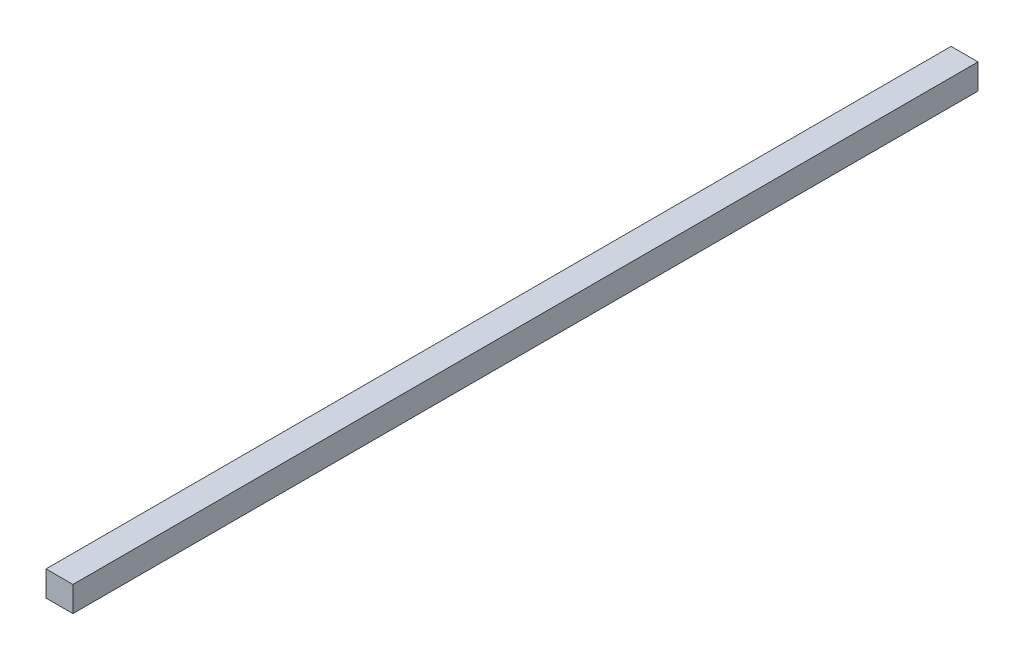
ISO-10303-21;
HEADER;
FILE_DESCRIPTION(('STEP AP214'),'2;1');
FILE_NAME('part.step','',(''),(''),'','','');
FILE_SCHEMA(('AUTOMOTIVE_DESIGN { 1 0 10303 214 1 1 1 1 }'));
ENDSEC;
DATA;
#1=APPLICATION_CONTEXT('core data for automotive mechanical design processes');
#2=APPLICATION_PROTOCOL_DEFINITION('international standard','automotive_design',2000,#1);
#3=PRODUCT_CONTEXT('',#1,'mechanical');
#4=PRODUCT('Part','Part','',(#3));
#5=PRODUCT_RELATED_PRODUCT_CATEGORY('part','',(#4));
#6=PRODUCT_DEFINITION_FORMATION('','',#4);
#7=PRODUCT_DEFINITION_CONTEXT('part definition',#1,'design');
#8=PRODUCT_DEFINITION('design','',#6,#7);
#9=PRODUCT_DEFINITION_SHAPE('','',#8);
#10=(LENGTH_UNIT() NAMED_UNIT(*) SI_UNIT(.MILLI.,.METRE.));
#11=(NAMED_UNIT(*) PLANE_ANGLE_UNIT() SI_UNIT($,.RADIAN.));
#12=(NAMED_UNIT(*) SI_UNIT($,.STERADIAN.) SOLID_ANGLE_UNIT());
#13=UNCERTAINTY_MEASURE_WITH_UNIT(LENGTH_MEASURE(1.E-05),#10,'distance_accuracy_value','');
#14=(GEOMETRIC_REPRESENTATION_CONTEXT(3) GLOBAL_UNCERTAINTY_ASSIGNED_CONTEXT((#13)) GLOBAL_UNIT_ASSIGNED_CONTEXT((#10,
#11,#12)) REPRESENTATION_CONTEXT('',''));
#15=CARTESIAN_POINT('',(0.,0.,0.));
#16=DIRECTION('',(0.,0.,1.));
#17=DIRECTION('',(1.,0.,0.));
#18=AXIS2_PLACEMENT_3D('',#15,#16,#17);
#19=CARTESIAN_POINT('',(-33.7662337662337,17.8571428571429,1682.));
#20=DIRECTION('',(1.,0.,0.));
#21=DIRECTION('',(0.,0.,-1.));
#22=AXIS2_PLACEMENT_3D('',#19,#20,#21);
#23=PLANE('',#22);
#24=DIRECTION('',(0.,-1.,0.));
#25=VECTOR('',#24,1.);
#26=CARTESIAN_POINT('',(-33.7662337662337,17.8571428571429,0.));
#27=LINE('',#26,#25);
#28=CARTESIAN_POINT('',(-33.7662337662337,17.8571428571429,0.));
#29=VERTEX_POINT('',#28);
#30=CARTESIAN_POINT('',(-33.7662337662337,-29.1428571428571,0.));
#31=VERTEX_POINT('',#30);
#32=EDGE_CURVE('E107',#29,#31,#27,.T.);
#33=ORIENTED_EDGE('',*,*,#32,.T.);
#34=DIRECTION('',(0.,0.,-1.));
#35=VECTOR('',#34,1.);
#36=CARTESIAN_POINT('',(-33.7662337662337,-29.1428571428571,1682.));
#37=LINE('',#36,#35);
#38=CARTESIAN_POINT('',(-33.7662337662337,-29.1428571428571,1682.));
#39=VERTEX_POINT('',#38);
#40=EDGE_CURVE('E11',#39,#31,#37,.T.);
#41=ORIENTED_EDGE('',*,*,#40,.F.);
#42=DIRECTION('',(0.,-1.,0.));
#43=VECTOR('',#42,1.);
#44=CARTESIAN_POINT('',(-33.7662337662337,17.8571428571429,1682.));
#45=LINE('',#44,#43);
#46=CARTESIAN_POINT('',(-33.7662337662337,17.8571428571429,1682.));
#47=VERTEX_POINT('',#46);
#48=EDGE_CURVE('E91',#47,#39,#45,.T.);
#49=ORIENTED_EDGE('',*,*,#48,.F.);
#50=DIRECTION('',(0.,0.,-1.));
#51=VECTOR('',#50,1.);
#52=CARTESIAN_POINT('',(-33.7662337662337,17.8571428571429,1682.));
#53=LINE('',#52,#51);
#54=EDGE_CURVE('E103',#47,#29,#53,.T.);
#55=ORIENTED_EDGE('',*,*,#54,.T.);
#56=EDGE_LOOP('',(#33,#41,#49,#55));
#57=FACE_BOUND('',#56,.T.);
#58=ADVANCED_FACE('F39',(#57),#23,.F.);
#59=CARTESIAN_POINT('',(-33.7662337662337,-29.1428571428571,1682.));
#60=DIRECTION('',(0.,1.,0.));
#61=DIRECTION('',(0.,0.,1.));
#62=AXIS2_PLACEMENT_3D('',#59,#60,#61);
#63=PLANE('',#62);
#64=DIRECTION('',(1.,0.,0.));
#65=VECTOR('',#64,1.);
#66=CARTESIAN_POINT('',(-33.7662337662337,-29.1428571428571,0.));
#67=LINE('',#66,#65);
#68=CARTESIAN_POINT('',(16.2337662337663,-29.1428571428571,0.));
#69=VERTEX_POINT('',#68);
#70=EDGE_CURVE('E96',#31,#69,#67,.T.);
#71=ORIENTED_EDGE('',*,*,#70,.T.);
#72=DIRECTION('',(0.,0.,-1.));
#73=VECTOR('',#72,1.);
#74=CARTESIAN_POINT('',(16.2337662337663,-29.1428571428571,1682.));
#75=LINE('',#74,#73);
#76=CARTESIAN_POINT('',(16.2337662337663,-29.1428571428571,1682.));
#77=VERTEX_POINT('',#76);
#78=EDGE_CURVE('E48',#77,#69,#75,.T.);
#79=ORIENTED_EDGE('',*,*,#78,.F.);
#80=DIRECTION('',(1.,0.,0.));
#81=VECTOR('',#80,1.);
#82=CARTESIAN_POINT('',(-33.7662337662337,-29.1428571428571,1682.));
#83=LINE('',#82,#81);
#84=EDGE_CURVE('E86',#39,#77,#83,.T.);
#85=ORIENTED_EDGE('',*,*,#84,.F.);
#86=ORIENTED_EDGE('',*,*,#40,.T.);
#87=EDGE_LOOP('',(#71,#79,#85,#86));
#88=FACE_BOUND('',#87,.T.);
#89=ADVANCED_FACE('F95',(#88),#63,.F.);
#90=CARTESIAN_POINT('',(16.2337662337663,17.8571428571429,1682.));
#91=DIRECTION('',(-1.,0.,0.));
#92=DIRECTION('',(0.,-1.,0.));
#93=AXIS2_PLACEMENT_3D('',#90,#91,#92);
#94=PLANE('',#93);
#95=DIRECTION('',(0.,1.,0.));
#96=VECTOR('',#95,1.);
#97=CARTESIAN_POINT('',(16.2337662337663,17.8571428571429,0.));
#98=LINE('',#97,#96);
#99=CARTESIAN_POINT('',(16.2337662337663,17.8571428571429,0.));
#100=VERTEX_POINT('',#99);
#101=EDGE_CURVE('E73',#69,#100,#98,.T.);
#102=ORIENTED_EDGE('',*,*,#101,.T.);
#103=DIRECTION('',(0.,0.,-1.));
#104=VECTOR('',#103,1.);
#105=CARTESIAN_POINT('',(16.2337662337663,17.8571428571429,1682.));
#106=LINE('',#105,#104);
#107=CARTESIAN_POINT('',(16.2337662337663,17.8571428571429,1682.));
#108=VERTEX_POINT('',#107);
#109=EDGE_CURVE('E98',#108,#100,#106,.T.);
#110=ORIENTED_EDGE('',*,*,#109,.F.);
#111=DIRECTION('',(0.,1.,0.));
#112=VECTOR('',#111,1.);
#113=CARTESIAN_POINT('',(16.2337662337663,17.8571428571429,1682.));
#114=LINE('',#113,#112);
#115=EDGE_CURVE('E89',#77,#108,#114,.T.);
#116=ORIENTED_EDGE('',*,*,#115,.F.);
#117=ORIENTED_EDGE('',*,*,#78,.T.);
#118=EDGE_LOOP('',(#102,#110,#116,#117));
#119=FACE_BOUND('',#118,.T.);
#120=ADVANCED_FACE('F99',(#119),#94,.F.);
#121=CARTESIAN_POINT('',(-33.7662337662337,17.8571428571429,1682.));
#122=DIRECTION('',(0.,-1.,0.));
#123=DIRECTION('',(0.,0.,-1.));
#124=AXIS2_PLACEMENT_3D('',#121,#122,#123);
#125=PLANE('',#124);
#126=DIRECTION('',(-1.,0.,0.));
#127=VECTOR('',#126,1.);
#128=CARTESIAN_POINT('',(-33.7662337662337,17.8571428571429,0.));
#129=LINE('',#128,#127);
#130=EDGE_CURVE('E79',#100,#29,#129,.T.);
#131=ORIENTED_EDGE('',*,*,#130,.T.);
#132=ORIENTED_EDGE('',*,*,#54,.F.);
#133=DIRECTION('',(-1.,0.,0.));
#134=VECTOR('',#133,1.);
#135=CARTESIAN_POINT('',(-33.7662337662337,17.8571428571429,1682.));
#136=LINE('',#135,#134);
#137=EDGE_CURVE('E56',#108,#47,#136,.T.);
#138=ORIENTED_EDGE('',*,*,#137,.F.);
#139=ORIENTED_EDGE('',*,*,#109,.T.);
#140=EDGE_LOOP('',(#131,#132,#138,#139));
#141=FACE_BOUND('',#140,.T.);
#142=ADVANCED_FACE('F120',(#141),#125,.F.);
#143=CARTESIAN_POINT('',(0.,0.,1682.));
#144=DIRECTION('',(0.,0.,1.));
#145=DIRECTION('',(1.,0.,0.));
#146=AXIS2_PLACEMENT_3D('',#143,#144,#145);
#147=PLANE('',#146);
#148=ORIENTED_EDGE('',*,*,#48,.T.);
#149=ORIENTED_EDGE('',*,*,#84,.T.);
#150=ORIENTED_EDGE('',*,*,#115,.T.);
#151=ORIENTED_EDGE('',*,*,#137,.T.);
#152=EDGE_LOOP('',(#148,#149,#150,#151));
#153=FACE_BOUND('',#152,.T.);
#154=ADVANCED_FACE('F87',(#153),#147,.T.);
#155=CARTESIAN_POINT('',(0.,0.,0.));
#156=DIRECTION('',(0.,0.,1.));
#157=DIRECTION('',(1.,0.,0.));
#158=AXIS2_PLACEMENT_3D('',#155,#156,#157);
#159=PLANE('',#158);
#160=ORIENTED_EDGE('',*,*,#32,.F.);
#161=ORIENTED_EDGE('',*,*,#130,.F.);
#162=ORIENTED_EDGE('',*,*,#101,.F.);
#163=ORIENTED_EDGE('',*,*,#70,.F.);
#164=EDGE_LOOP('',(#160,#161,#162,#163));
#165=FACE_BOUND('',#164,.T.);
#166=ADVANCED_FACE('F123',(#165),#159,.F.);
#167=CLOSED_SHELL('',(#58,#89,#120,#142,#154,#166));
#168=MANIFOLD_SOLID_BREP('B2',#167);
#169=ADVANCED_BREP_SHAPE_REPRESENTATION('',(#18,#168),#14);
#170=SHAPE_DEFINITION_REPRESENTATION(#9,#169);
ENDSEC;
END-ISO-10303-21;
